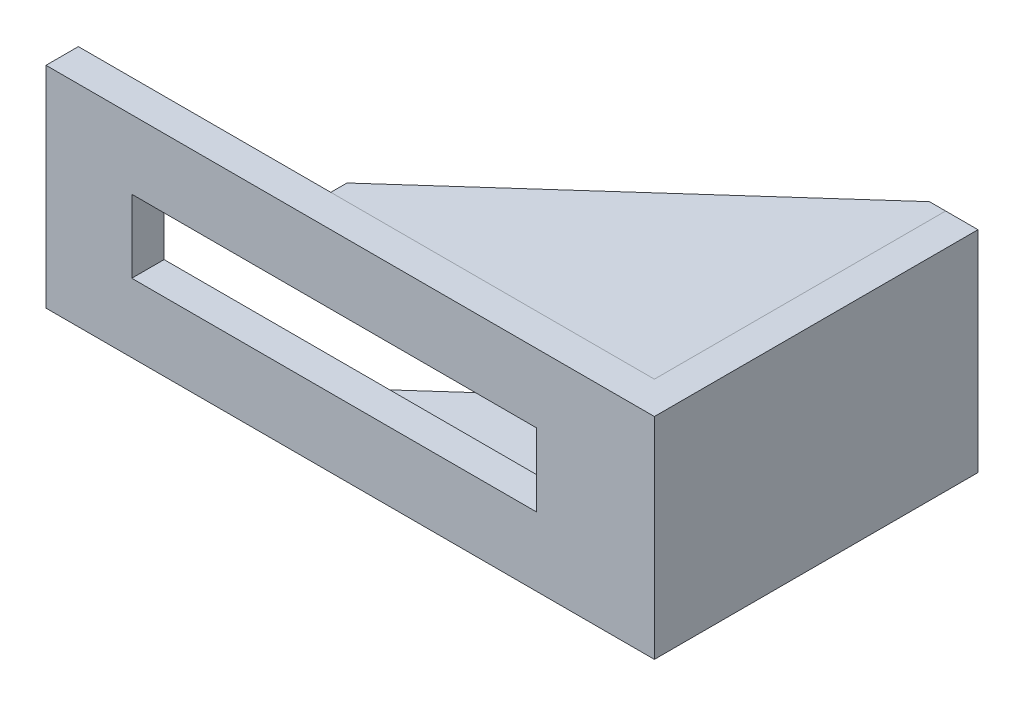
ISO-10303-21;
HEADER;
FILE_DESCRIPTION(('STEP AP214'),'2;1');
FILE_NAME('part.step','',(''),(''),'','','');
FILE_SCHEMA(('AUTOMOTIVE_DESIGN { 1 0 10303 214 1 1 1 1 }'));
ENDSEC;
DATA;
#1=APPLICATION_CONTEXT('core data for automotive mechanical design processes');
#2=APPLICATION_PROTOCOL_DEFINITION('international standard','automotive_design',2000,#1);
#3=PRODUCT_CONTEXT('',#1,'mechanical');
#4=PRODUCT('Part','Part','',(#3));
#5=PRODUCT_RELATED_PRODUCT_CATEGORY('part','',(#4));
#6=PRODUCT_DEFINITION_FORMATION('','',#4);
#7=PRODUCT_DEFINITION_CONTEXT('part definition',#1,'design');
#8=PRODUCT_DEFINITION('design','',#6,#7);
#9=PRODUCT_DEFINITION_SHAPE('','',#8);
#10=(LENGTH_UNIT() NAMED_UNIT(*) SI_UNIT(.MILLI.,.METRE.));
#11=(NAMED_UNIT(*) PLANE_ANGLE_UNIT() SI_UNIT($,.RADIAN.));
#12=(NAMED_UNIT(*) SI_UNIT($,.STERADIAN.) SOLID_ANGLE_UNIT());
#13=UNCERTAINTY_MEASURE_WITH_UNIT(LENGTH_MEASURE(1.E-05),#10,'distance_accuracy_value','');
#14=(GEOMETRIC_REPRESENTATION_CONTEXT(3) GLOBAL_UNCERTAINTY_ASSIGNED_CONTEXT((#13)) GLOBAL_UNIT_ASSIGNED_CONTEXT((#10,
#11,#12)) REPRESENTATION_CONTEXT('',''));
#15=CARTESIAN_POINT('',(0.,0.,0.));
#16=DIRECTION('',(0.,0.,1.));
#17=DIRECTION('',(1.,0.,0.));
#18=AXIS2_PLACEMENT_3D('',#15,#16,#17);
#19=CARTESIAN_POINT('',(178.,45.,0.));
#20=DIRECTION('',(1.,0.,0.));
#21=DIRECTION('',(0.,0.,-1.));
#22=AXIS2_PLACEMENT_3D('',#19,#20,#21);
#23=PLANE('',#22);
#24=DIRECTION('',(0.,0.,1.));
#25=VECTOR('',#24,1.);
#26=CARTESIAN_POINT('',(178.,65.,0.));
#27=LINE('',#26,#25);
#28=CARTESIAN_POINT('',(178.,65.,-180.));
#29=VERTEX_POINT('',#28);
#30=CARTESIAN_POINT('',(178.,65.,0.));
#31=VERTEX_POINT('',#30);
#32=EDGE_CURVE('E120',#29,#31,#27,.T.);
#33=ORIENTED_EDGE('',*,*,#32,.T.);
#34=DIRECTION('',(0.,1.,0.));
#35=VECTOR('',#34,1.);
#36=CARTESIAN_POINT('',(178.,45.,0.));
#37=LINE('',#36,#35);
#38=CARTESIAN_POINT('',(178.,45.,0.));
#39=VERTEX_POINT('',#38);
#40=EDGE_CURVE('E48',#39,#31,#37,.T.);
#41=ORIENTED_EDGE('',*,*,#40,.F.);
#42=DIRECTION('',(0.,0.,1.));
#43=VECTOR('',#42,1.);
#44=CARTESIAN_POINT('',(178.,45.,0.));
#45=LINE('',#44,#43);
#46=CARTESIAN_POINT('',(178.,45.,-180.));
#47=VERTEX_POINT('',#46);
#48=EDGE_CURVE('E127',#47,#39,#45,.T.);
#49=ORIENTED_EDGE('',*,*,#48,.F.);
#50=DIRECTION('',(0.,1.,0.));
#51=VECTOR('',#50,1.);
#52=CARTESIAN_POINT('',(178.,45.,-180.));
#53=LINE('',#52,#51);
#54=EDGE_CURVE('E12',#47,#29,#53,.T.);
#55=ORIENTED_EDGE('',*,*,#54,.T.);
#56=EDGE_LOOP('',(#33,#41,#49,#55));
#57=FACE_BOUND('',#56,.T.);
#58=ADVANCED_FACE('F45',(#57),#23,.T.);
#59=CARTESIAN_POINT('',(178.,45.,-180.));
#60=DIRECTION('',(0.,0.,-1.));
#61=DIRECTION('',(-1.,0.,0.));
#62=AXIS2_PLACEMENT_3D('',#59,#60,#61);
#63=PLANE('',#62);
#64=DIRECTION('',(1.,0.,0.));
#65=VECTOR('',#64,1.);
#66=CARTESIAN_POINT('',(178.,65.,-180.));
#67=LINE('',#66,#65);
#68=CARTESIAN_POINT('',(168.,65.,-180.));
#69=VERTEX_POINT('',#68);
#70=EDGE_CURVE('E89',#69,#29,#67,.T.);
#71=ORIENTED_EDGE('',*,*,#70,.T.);
#72=ORIENTED_EDGE('',*,*,#54,.F.);
#73=DIRECTION('',(1.,0.,0.));
#74=VECTOR('',#73,1.);
#75=CARTESIAN_POINT('',(178.,45.,-180.));
#76=LINE('',#75,#74);
#77=CARTESIAN_POINT('',(168.,45.,-180.));
#78=VERTEX_POINT('',#77);
#79=EDGE_CURVE('E63',#78,#47,#76,.T.);
#80=ORIENTED_EDGE('',*,*,#79,.F.);
#81=DIRECTION('',(0.,1.,0.));
#82=VECTOR('',#81,1.);
#83=CARTESIAN_POINT('',(168.,45.,-180.));
#84=LINE('',#83,#82);
#85=EDGE_CURVE('E54',#78,#69,#84,.T.);
#86=ORIENTED_EDGE('',*,*,#85,.T.);
#87=EDGE_LOOP('',(#71,#72,#80,#86));
#88=FACE_BOUND('',#87,.T.);
#89=ADVANCED_FACE('F144',(#88),#63,.T.);
#90=CARTESIAN_POINT('',(168.,45.,-180.));
#91=DIRECTION('',(-0.666794859469826,0.,-0.745241313525099));
#92=DIRECTION('',(-0.745241313525099,0.,0.666794859469826));
#93=AXIS2_PLACEMENT_3D('',#90,#91,#92);
#94=PLANE('',#93);
#95=DIRECTION('',(0.745241313525099,0.,-0.666794859469826));
#96=VECTOR('',#95,1.);
#97=CARTESIAN_POINT('',(168.,65.,-180.));
#98=LINE('',#97,#96);
#99=CARTESIAN_POINT('',(-22.,65.,-10.));
#100=VERTEX_POINT('',#99);
#101=EDGE_CURVE('E83',#100,#69,#98,.T.);
#102=ORIENTED_EDGE('',*,*,#101,.T.);
#103=ORIENTED_EDGE('',*,*,#85,.F.);
#104=DIRECTION('',(0.745241313525099,0.,-0.666794859469826));
#105=VECTOR('',#104,1.);
#106=CARTESIAN_POINT('',(168.,45.,-180.));
#107=LINE('',#106,#105);
#108=CARTESIAN_POINT('',(-22.,45.,-10.));
#109=VERTEX_POINT('',#108);
#110=EDGE_CURVE('E105',#109,#78,#107,.T.);
#111=ORIENTED_EDGE('',*,*,#110,.F.);
#112=DIRECTION('',(0.,1.,0.));
#113=VECTOR('',#112,1.);
#114=CARTESIAN_POINT('',(-22.,45.,-10.));
#115=LINE('',#114,#113);
#116=EDGE_CURVE('E109',#109,#100,#115,.T.);
#117=ORIENTED_EDGE('',*,*,#116,.T.);
#118=EDGE_LOOP('',(#102,#103,#111,#117));
#119=FACE_BOUND('',#118,.T.);
#120=ADVANCED_FACE('F115',(#119),#94,.T.);
#121=CARTESIAN_POINT('',(-22.,45.,-10.));
#122=DIRECTION('',(-1.,0.,0.));
#123=DIRECTION('',(0.,0.,1.));
#124=AXIS2_PLACEMENT_3D('',#121,#122,#123);
#125=PLANE('',#124);
#126=DIRECTION('',(0.,0.,-1.));
#127=VECTOR('',#126,1.);
#128=CARTESIAN_POINT('',(-22.,65.,-10.));
#129=LINE('',#128,#127);
#130=CARTESIAN_POINT('',(-22.,65.,0.));
#131=VERTEX_POINT('',#130);
#132=EDGE_CURVE('E112',#131,#100,#129,.T.);
#133=ORIENTED_EDGE('',*,*,#132,.T.);
#134=ORIENTED_EDGE('',*,*,#116,.F.);
#135=DIRECTION('',(0.,0.,-1.));
#136=VECTOR('',#135,1.);
#137=CARTESIAN_POINT('',(-22.,45.,-10.));
#138=LINE('',#137,#136);
#139=CARTESIAN_POINT('',(-22.,45.,0.));
#140=VERTEX_POINT('',#139);
#141=EDGE_CURVE('E101',#140,#109,#138,.T.);
#142=ORIENTED_EDGE('',*,*,#141,.F.);
#143=DIRECTION('',(0.,1.,0.));
#144=VECTOR('',#143,1.);
#145=CARTESIAN_POINT('',(-22.,45.,0.));
#146=LINE('',#145,#144);
#147=EDGE_CURVE('E113',#140,#131,#146,.T.);
#148=ORIENTED_EDGE('',*,*,#147,.T.);
#149=EDGE_LOOP('',(#133,#134,#142,#148));
#150=FACE_BOUND('',#149,.T.);
#151=ADVANCED_FACE('F110',(#150),#125,.T.);
#152=CARTESIAN_POINT('',(-22.,45.,0.));
#153=DIRECTION('',(0.,0.,1.));
#154=DIRECTION('',(1.,0.,0.));
#155=AXIS2_PLACEMENT_3D('',#152,#153,#154);
#156=PLANE('',#155);
#157=DIRECTION('',(-1.,0.,0.));
#158=VECTOR('',#157,1.);
#159=CARTESIAN_POINT('',(-22.,65.,0.));
#160=LINE('',#159,#158);
#161=EDGE_CURVE('E123',#31,#131,#160,.T.);
#162=ORIENTED_EDGE('',*,*,#161,.T.);
#163=ORIENTED_EDGE('',*,*,#147,.F.);
#164=DIRECTION('',(-1.,0.,0.));
#165=VECTOR('',#164,1.);
#166=CARTESIAN_POINT('',(-22.,45.,0.));
#167=LINE('',#166,#165);
#168=EDGE_CURVE('E97',#39,#140,#167,.T.);
#169=ORIENTED_EDGE('',*,*,#168,.F.);
#170=ORIENTED_EDGE('',*,*,#40,.T.);
#171=EDGE_LOOP('',(#162,#163,#169,#170));
#172=FACE_BOUND('',#171,.T.);
#173=ADVANCED_FACE('F130',(#172),#156,.T.);
#174=CARTESIAN_POINT('',(0.,45.,0.));
#175=DIRECTION('',(0.,-1.,0.));
#176=DIRECTION('',(0.,0.,1.));
#177=AXIS2_PLACEMENT_3D('',#174,#175,#176);
#178=PLANE('',#177);
#179=ORIENTED_EDGE('',*,*,#48,.T.);
#180=ORIENTED_EDGE('',*,*,#168,.T.);
#181=ORIENTED_EDGE('',*,*,#141,.T.);
#182=ORIENTED_EDGE('',*,*,#110,.T.);
#183=ORIENTED_EDGE('',*,*,#79,.T.);
#184=EDGE_LOOP('',(#179,#180,#181,#182,#183));
#185=FACE_BOUND('',#184,.T.);
#186=ADVANCED_FACE('F103',(#185),#178,.T.);
#187=CARTESIAN_POINT('',(0.,65.,0.));
#188=DIRECTION('',(0.,-1.,0.));
#189=DIRECTION('',(0.,0.,1.));
#190=AXIS2_PLACEMENT_3D('',#187,#188,#189);
#191=PLANE('',#190);
#192=ORIENTED_EDGE('',*,*,#32,.F.);
#193=ORIENTED_EDGE('',*,*,#70,.F.);
#194=ORIENTED_EDGE('',*,*,#101,.F.);
#195=ORIENTED_EDGE('',*,*,#132,.F.);
#196=ORIENTED_EDGE('',*,*,#161,.F.);
#197=EDGE_LOOP('',(#192,#193,#194,#195,#196));
#198=FACE_BOUND('',#197,.T.);
#199=ADVANCED_FACE('F135',(#198),#191,.F.);
#200=CLOSED_SHELL('',(#58,#89,#120,#151,#173,#186,#199));
#201=MANIFOLD_SOLID_BREP('B2',#200);
#202=CARTESIAN_POINT('',(178.,-45.,0.));
#203=DIRECTION('',(1.,0.,0.));
#204=DIRECTION('',(0.,0.,-1.));
#205=AXIS2_PLACEMENT_3D('',#202,#203,#204);
#206=PLANE('',#205);
#207=DIRECTION('',(0.,0.,1.));
#208=VECTOR('',#207,1.);
#209=CARTESIAN_POINT('',(178.,-65.,0.));
#210=LINE('',#209,#208);
#211=CARTESIAN_POINT('',(178.,-65.,-180.));
#212=VERTEX_POINT('',#211);
#213=CARTESIAN_POINT('',(178.,-65.,0.));
#214=VERTEX_POINT('',#213);
#215=EDGE_CURVE('E280',#212,#214,#210,.T.);
#216=ORIENTED_EDGE('',*,*,#215,.F.);
#217=DIRECTION('',(0.,-1.,0.));
#218=VECTOR('',#217,1.);
#219=CARTESIAN_POINT('',(178.,-45.,-180.));
#220=LINE('',#219,#218);
#221=CARTESIAN_POINT('',(178.,-45.,-180.));
#222=VERTEX_POINT('',#221);
#223=EDGE_CURVE('E43',#222,#212,#220,.T.);
#224=ORIENTED_EDGE('',*,*,#223,.F.);
#225=DIRECTION('',(0.,0.,1.));
#226=VECTOR('',#225,1.);
#227=CARTESIAN_POINT('',(178.,-45.,0.));
#228=LINE('',#227,#226);
#229=CARTESIAN_POINT('',(178.,-45.,0.));
#230=VERTEX_POINT('',#229);
#231=EDGE_CURVE('E275',#222,#230,#228,.T.);
#232=ORIENTED_EDGE('',*,*,#231,.T.);
#233=DIRECTION('',(0.,-1.,0.));
#234=VECTOR('',#233,1.);
#235=CARTESIAN_POINT('',(178.,-45.,0.));
#236=LINE('',#235,#234);
#237=EDGE_CURVE('E206',#230,#214,#236,.T.);
#238=ORIENTED_EDGE('',*,*,#237,.T.);
#239=EDGE_LOOP('',(#216,#224,#232,#238));
#240=FACE_BOUND('',#239,.T.);
#241=ADVANCED_FACE('F203',(#240),#206,.T.);
#242=CARTESIAN_POINT('',(178.,-45.,-180.));
#243=DIRECTION('',(0.,0.,-1.));
#244=DIRECTION('',(-1.,0.,0.));
#245=AXIS2_PLACEMENT_3D('',#242,#243,#244);
#246=PLANE('',#245);
#247=DIRECTION('',(1.,0.,0.));
#248=VECTOR('',#247,1.);
#249=CARTESIAN_POINT('',(178.,-65.,-180.));
#250=LINE('',#249,#248);
#251=CARTESIAN_POINT('',(168.,-65.,-180.));
#252=VERTEX_POINT('',#251);
#253=EDGE_CURVE('E289',#252,#212,#250,.T.);
#254=ORIENTED_EDGE('',*,*,#253,.F.);
#255=DIRECTION('',(0.,-1.,0.));
#256=VECTOR('',#255,1.);
#257=CARTESIAN_POINT('',(168.,-45.,-180.));
#258=LINE('',#257,#256);
#259=CARTESIAN_POINT('',(168.,-45.,-180.));
#260=VERTEX_POINT('',#259);
#261=EDGE_CURVE('E212',#260,#252,#258,.T.);
#262=ORIENTED_EDGE('',*,*,#261,.F.);
#263=DIRECTION('',(1.,0.,0.));
#264=VECTOR('',#263,1.);
#265=CARTESIAN_POINT('',(178.,-45.,-180.));
#266=LINE('',#265,#264);
#267=EDGE_CURVE('E270',#260,#222,#266,.T.);
#268=ORIENTED_EDGE('',*,*,#267,.T.);
#269=ORIENTED_EDGE('',*,*,#223,.T.);
#270=EDGE_LOOP('',(#254,#262,#268,#269));
#271=FACE_BOUND('',#270,.T.);
#272=ADVANCED_FACE('F295',(#271),#246,.T.);
#273=CARTESIAN_POINT('',(168.,-45.,-180.));
#274=DIRECTION('',(-0.666794859469826,0.,-0.745241313525099));
#275=DIRECTION('',(-0.745241313525099,0.,0.666794859469826));
#276=AXIS2_PLACEMENT_3D('',#273,#274,#275);
#277=PLANE('',#276);
#278=DIRECTION('',(0.745241313525099,0.,-0.666794859469826));
#279=VECTOR('',#278,1.);
#280=CARTESIAN_POINT('',(168.,-65.,-180.));
#281=LINE('',#280,#279);
#282=CARTESIAN_POINT('',(-22.,-65.,-10.));
#283=VERTEX_POINT('',#282);
#284=EDGE_CURVE('E259',#283,#252,#281,.T.);
#285=ORIENTED_EDGE('',*,*,#284,.F.);
#286=DIRECTION('',(0.,-1.,0.));
#287=VECTOR('',#286,1.);
#288=CARTESIAN_POINT('',(-22.,-45.,-10.));
#289=LINE('',#288,#287);
#290=CARTESIAN_POINT('',(-22.,-45.,-10.));
#291=VERTEX_POINT('',#290);
#292=EDGE_CURVE('E254',#291,#283,#289,.T.);
#293=ORIENTED_EDGE('',*,*,#292,.F.);
#294=DIRECTION('',(0.745241313525099,0.,-0.666794859469826));
#295=VECTOR('',#294,1.);
#296=CARTESIAN_POINT('',(168.,-45.,-180.));
#297=LINE('',#296,#295);
#298=EDGE_CURVE('E257',#291,#260,#297,.T.);
#299=ORIENTED_EDGE('',*,*,#298,.T.);
#300=ORIENTED_EDGE('',*,*,#261,.T.);
#301=EDGE_LOOP('',(#285,#293,#299,#300));
#302=FACE_BOUND('',#301,.T.);
#303=ADVANCED_FACE('F256',(#302),#277,.T.);
#304=CARTESIAN_POINT('',(-22.,-45.,-10.));
#305=DIRECTION('',(-1.,0.,0.));
#306=DIRECTION('',(0.,0.,1.));
#307=AXIS2_PLACEMENT_3D('',#304,#305,#306);
#308=PLANE('',#307);
#309=DIRECTION('',(0.,0.,-1.));
#310=VECTOR('',#309,1.);
#311=CARTESIAN_POINT('',(-22.,-65.,-10.));
#312=LINE('',#311,#310);
#313=CARTESIAN_POINT('',(-22.,-65.,0.));
#314=VERTEX_POINT('',#313);
#315=EDGE_CURVE('E286',#314,#283,#312,.T.);
#316=ORIENTED_EDGE('',*,*,#315,.F.);
#317=DIRECTION('',(0.,-1.,0.));
#318=VECTOR('',#317,1.);
#319=CARTESIAN_POINT('',(-22.,-45.,0.));
#320=LINE('',#319,#318);
#321=CARTESIAN_POINT('',(-22.,-45.,0.));
#322=VERTEX_POINT('',#321);
#323=EDGE_CURVE('E264',#322,#314,#320,.T.);
#324=ORIENTED_EDGE('',*,*,#323,.F.);
#325=DIRECTION('',(0.,0.,-1.));
#326=VECTOR('',#325,1.);
#327=CARTESIAN_POINT('',(-22.,-45.,-10.));
#328=LINE('',#327,#326);
#329=EDGE_CURVE('E269',#322,#291,#328,.T.);
#330=ORIENTED_EDGE('',*,*,#329,.T.);
#331=ORIENTED_EDGE('',*,*,#292,.T.);
#332=EDGE_LOOP('',(#316,#324,#330,#331));
#333=FACE_BOUND('',#332,.T.);
#334=ADVANCED_FACE('F272',(#333),#308,.T.);
#335=CARTESIAN_POINT('',(-22.,-45.,0.));
#336=DIRECTION('',(0.,0.,1.));
#337=DIRECTION('',(1.,0.,0.));
#338=AXIS2_PLACEMENT_3D('',#335,#336,#337);
#339=PLANE('',#338);
#340=DIRECTION('',(-1.,0.,0.));
#341=VECTOR('',#340,1.);
#342=CARTESIAN_POINT('',(-22.,-65.,0.));
#343=LINE('',#342,#341);
#344=EDGE_CURVE('E283',#214,#314,#343,.T.);
#345=ORIENTED_EDGE('',*,*,#344,.F.);
#346=ORIENTED_EDGE('',*,*,#237,.F.);
#347=DIRECTION('',(-1.,0.,0.));
#348=VECTOR('',#347,1.);
#349=CARTESIAN_POINT('',(-22.,-45.,0.));
#350=LINE('',#349,#348);
#351=EDGE_CURVE('E273',#230,#322,#350,.T.);
#352=ORIENTED_EDGE('',*,*,#351,.T.);
#353=ORIENTED_EDGE('',*,*,#323,.T.);
#354=EDGE_LOOP('',(#345,#346,#352,#353));
#355=FACE_BOUND('',#354,.T.);
#356=ADVANCED_FACE('F292',(#355),#339,.T.);
#357=CARTESIAN_POINT('',(0.,-45.,0.));
#358=DIRECTION('',(0.,1.,0.));
#359=DIRECTION('',(0.,0.,1.));
#360=AXIS2_PLACEMENT_3D('',#357,#358,#359);
#361=PLANE('',#360);
#362=ORIENTED_EDGE('',*,*,#231,.F.);
#363=ORIENTED_EDGE('',*,*,#267,.F.);
#364=ORIENTED_EDGE('',*,*,#298,.F.);
#365=ORIENTED_EDGE('',*,*,#329,.F.);
#366=ORIENTED_EDGE('',*,*,#351,.F.);
#367=EDGE_LOOP('',(#362,#363,#364,#365,#366));
#368=FACE_BOUND('',#367,.T.);
#369=ADVANCED_FACE('F268',(#368),#361,.T.);
#370=CARTESIAN_POINT('',(0.,-65.,0.));
#371=DIRECTION('',(0.,1.,0.));
#372=DIRECTION('',(0.,0.,1.));
#373=AXIS2_PLACEMENT_3D('',#370,#371,#372);
#374=PLANE('',#373);
#375=ORIENTED_EDGE('',*,*,#215,.T.);
#376=ORIENTED_EDGE('',*,*,#344,.T.);
#377=ORIENTED_EDGE('',*,*,#315,.T.);
#378=ORIENTED_EDGE('',*,*,#284,.T.);
#379=ORIENTED_EDGE('',*,*,#253,.T.);
#380=EDGE_LOOP('',(#375,#376,#377,#378,#379));
#381=FACE_BOUND('',#380,.T.);
#382=ADVANCED_FACE('F294',(#381),#374,.F.);
#383=CLOSED_SHELL('',(#241,#272,#303,#334,#356,#369,#382));
#384=MANIFOLD_SOLID_BREP('B6',#383);
#385=CARTESIAN_POINT('',(-178.,65.,20.));
#386=DIRECTION('',(0.,-1.,0.));
#387=DIRECTION('',(0.,0.,-1.));
#388=AXIS2_PLACEMENT_3D('',#385,#386,#387);
#389=PLANE('',#388);
#390=DIRECTION('',(-1.,0.,0.));
#391=VECTOR('',#390,1.);
#392=CARTESIAN_POINT('',(-178.,65.,0.));
#393=LINE('',#392,#391);
#394=CARTESIAN_POINT('',(178.,65.,0.));
#395=VERTEX_POINT('',#394);
#396=CARTESIAN_POINT('',(-178.,65.,0.));
#397=VERTEX_POINT('',#396);
#398=EDGE_CURVE('E490',#395,#397,#393,.T.);
#399=ORIENTED_EDGE('',*,*,#398,.T.);
#400=DIRECTION('',(0.,0.,-1.));
#401=VECTOR('',#400,1.);
#402=CARTESIAN_POINT('',(-178.,65.,20.));
#403=LINE('',#402,#401);
#404=CARTESIAN_POINT('',(-178.,65.,20.));
#405=VERTEX_POINT('',#404);
#406=EDGE_CURVE('E497',#405,#397,#403,.T.);
#407=ORIENTED_EDGE('',*,*,#406,.F.);
#408=DIRECTION('',(-1.,0.,0.));
#409=VECTOR('',#408,1.);
#410=CARTESIAN_POINT('',(-178.,65.,20.));
#411=LINE('',#410,#409);
#412=CARTESIAN_POINT('',(198.,65.,20.));
#413=VERTEX_POINT('',#412);
#414=EDGE_CURVE('E480',#413,#405,#411,.T.);
#415=ORIENTED_EDGE('',*,*,#414,.F.);
#416=DIRECTION('',(0.,0.,1.));
#417=VECTOR('',#416,1.);
#418=CARTESIAN_POINT('',(198.,65.,20.));
#419=LINE('',#418,#417);
#420=CARTESIAN_POINT('',(198.,65.,-180.));
#421=VERTEX_POINT('',#420);
#422=EDGE_CURVE('E465',#421,#413,#419,.T.);
#423=ORIENTED_EDGE('',*,*,#422,.F.);
#424=DIRECTION('',(-1.,0.,0.));
#425=VECTOR('',#424,1.);
#426=CARTESIAN_POINT('',(198.,65.,-180.));
#427=LINE('',#426,#425);
#428=CARTESIAN_POINT('',(178.,65.,-180.));
#429=VERTEX_POINT('',#428);
#430=EDGE_CURVE('E468',#421,#429,#427,.T.);
#431=ORIENTED_EDGE('',*,*,#430,.T.);
#432=DIRECTION('',(0.,0.,1.));
#433=VECTOR('',#432,1.);
#434=CARTESIAN_POINT('',(178.,65.,20.));
#435=LINE('',#434,#433);
#436=EDGE_CURVE('E461',#429,#395,#435,.T.);
#437=ORIENTED_EDGE('',*,*,#436,.T.);
#438=EDGE_LOOP('',(#399,#407,#415,#423,#431,#437));
#439=FACE_BOUND('',#438,.T.);
#440=ADVANCED_FACE('F352',(#439),#389,.F.);
#441=CARTESIAN_POINT('',(-178.,65.,20.));
#442=DIRECTION('',(1.,0.,0.));
#443=DIRECTION('',(0.,0.,-1.));
#444=AXIS2_PLACEMENT_3D('',#441,#442,#443);
#445=PLANE('',#444);
#446=DIRECTION('',(0.,-1.,0.));
#447=VECTOR('',#446,1.);
#448=CARTESIAN_POINT('',(-178.,65.,0.));
#449=LINE('',#448,#447);
#450=CARTESIAN_POINT('',(-178.,-65.,0.));
#451=VERTEX_POINT('',#450);
#452=EDGE_CURVE('E492',#397,#451,#449,.T.);
#453=ORIENTED_EDGE('',*,*,#452,.T.);
#454=DIRECTION('',(0.,0.,-1.));
#455=VECTOR('',#454,1.);
#456=CARTESIAN_POINT('',(-178.,-65.,20.));
#457=LINE('',#456,#455);
#458=CARTESIAN_POINT('',(-178.,-65.,20.));
#459=VERTEX_POINT('',#458);
#460=EDGE_CURVE('E487',#459,#451,#457,.T.);
#461=ORIENTED_EDGE('',*,*,#460,.F.);
#462=DIRECTION('',(0.,-1.,0.));
#463=VECTOR('',#462,1.);
#464=CARTESIAN_POINT('',(-178.,65.,20.));
#465=LINE('',#464,#463);
#466=EDGE_CURVE('E482',#405,#459,#465,.T.);
#467=ORIENTED_EDGE('',*,*,#466,.F.);
#468=ORIENTED_EDGE('',*,*,#406,.T.);
#469=EDGE_LOOP('',(#453,#461,#467,#468));
#470=FACE_BOUND('',#469,.T.);
#471=ADVANCED_FACE('F524',(#470),#445,.F.);
#472=CARTESIAN_POINT('',(-178.,-65.,20.));
#473=DIRECTION('',(0.,1.,0.));
#474=DIRECTION('',(0.,0.,1.));
#475=AXIS2_PLACEMENT_3D('',#472,#473,#474);
#476=PLANE('',#475);
#477=DIRECTION('',(1.,0.,0.));
#478=VECTOR('',#477,1.);
#479=CARTESIAN_POINT('',(-178.,-65.,0.));
#480=LINE('',#479,#478);
#481=CARTESIAN_POINT('',(178.,-65.,0.));
#482=VERTEX_POINT('',#481);
#483=EDGE_CURVE('E483',#451,#482,#480,.T.);
#484=ORIENTED_EDGE('',*,*,#483,.T.);
#485=DIRECTION('',(0.,0.,-1.));
#486=VECTOR('',#485,1.);
#487=CARTESIAN_POINT('',(178.,-65.,20.));
#488=LINE('',#487,#486);
#489=CARTESIAN_POINT('',(178.,-65.,-180.));
#490=VERTEX_POINT('',#489);
#491=EDGE_CURVE('E454',#482,#490,#488,.T.);
#492=ORIENTED_EDGE('',*,*,#491,.T.);
#493=DIRECTION('',(-1.,0.,0.));
#494=VECTOR('',#493,1.);
#495=CARTESIAN_POINT('',(198.,-65.,-180.));
#496=LINE('',#495,#494);
#497=CARTESIAN_POINT('',(198.,-65.,-180.));
#498=VERTEX_POINT('',#497);
#499=EDGE_CURVE('E476',#498,#490,#496,.T.);
#500=ORIENTED_EDGE('',*,*,#499,.F.);
#501=DIRECTION('',(0.,0.,-1.));
#502=VECTOR('',#501,1.);
#503=CARTESIAN_POINT('',(198.,-65.,20.));
#504=LINE('',#503,#502);
#505=CARTESIAN_POINT('',(198.,-65.,20.));
#506=VERTEX_POINT('',#505);
#507=EDGE_CURVE('E460',#506,#498,#504,.T.);
#508=ORIENTED_EDGE('',*,*,#507,.F.);
#509=DIRECTION('',(1.,0.,0.));
#510=VECTOR('',#509,1.);
#511=CARTESIAN_POINT('',(-178.,-65.,20.));
#512=LINE('',#511,#510);
#513=EDGE_CURVE('E485',#459,#506,#512,.T.);
#514=ORIENTED_EDGE('',*,*,#513,.F.);
#515=ORIENTED_EDGE('',*,*,#460,.T.);
#516=EDGE_LOOP('',(#484,#492,#500,#508,#514,#515));
#517=FACE_BOUND('',#516,.T.);
#518=ADVANCED_FACE('F529',(#517),#476,.F.);
#519=CARTESIAN_POINT('',(0.,0.,20.));
#520=DIRECTION('',(0.,0.,1.));
#521=DIRECTION('',(1.,0.,0.));
#522=AXIS2_PLACEMENT_3D('',#519,#520,#521);
#523=PLANE('',#522);
#524=DIRECTION('',(0.,1.,0.));
#525=VECTOR('',#524,1.);
#526=CARTESIAN_POINT('',(125.,22.5,20.));
#527=LINE('',#526,#525);
#528=CARTESIAN_POINT('',(125.,-22.5,20.));
#529=VERTEX_POINT('',#528);
#530=CARTESIAN_POINT('',(125.,22.5,20.));
#531=VERTEX_POINT('',#530);
#532=EDGE_CURVE('E366',#529,#531,#527,.T.);
#533=ORIENTED_EDGE('',*,*,#532,.F.);
#534=DIRECTION('',(1.,0.,0.));
#535=VECTOR('',#534,1.);
#536=CARTESIAN_POINT('',(-125.,-22.5,20.));
#537=LINE('',#536,#535);
#538=CARTESIAN_POINT('',(-125.,-22.5,20.));
#539=VERTEX_POINT('',#538);
#540=EDGE_CURVE('E447',#539,#529,#537,.T.);
#541=ORIENTED_EDGE('',*,*,#540,.F.);
#542=DIRECTION('',(0.,-1.,0.));
#543=VECTOR('',#542,1.);
#544=CARTESIAN_POINT('',(-125.,22.5,20.));
#545=LINE('',#544,#543);
#546=CARTESIAN_POINT('',(-125.,22.5,20.));
#547=VERTEX_POINT('',#546);
#548=EDGE_CURVE('E431',#547,#539,#545,.T.);
#549=ORIENTED_EDGE('',*,*,#548,.F.);
#550=DIRECTION('',(-1.,0.,0.));
#551=VECTOR('',#550,1.);
#552=CARTESIAN_POINT('',(-125.,22.5,20.));
#553=LINE('',#552,#551);
#554=EDGE_CURVE('E440',#531,#547,#553,.T.);
#555=ORIENTED_EDGE('',*,*,#554,.F.);
#556=EDGE_LOOP('',(#533,#541,#549,#555));
#557=FACE_BOUND('',#556,.T.);
#558=ORIENTED_EDGE('',*,*,#513,.T.);
#559=DIRECTION('',(0.,-1.,0.));
#560=VECTOR('',#559,1.);
#561=CARTESIAN_POINT('',(198.,-65.,20.));
#562=LINE('',#561,#560);
#563=EDGE_CURVE('E457',#413,#506,#562,.T.);
#564=ORIENTED_EDGE('',*,*,#563,.F.);
#565=ORIENTED_EDGE('',*,*,#414,.T.);
#566=ORIENTED_EDGE('',*,*,#466,.T.);
#567=EDGE_LOOP('',(#558,#564,#565,#566));
#568=FACE_BOUND('',#567,.T.);
#569=ADVANCED_FACE('F444',(#557,#568),#523,.T.);
#570=CARTESIAN_POINT('',(0.,0.,0.));
#571=DIRECTION('',(0.,0.,1.));
#572=DIRECTION('',(1.,0.,0.));
#573=AXIS2_PLACEMENT_3D('',#570,#571,#572);
#574=PLANE('',#573);
#575=DIRECTION('',(1.,0.,0.));
#576=VECTOR('',#575,1.);
#577=CARTESIAN_POINT('',(0.,-22.5,0.));
#578=LINE('',#577,#576);
#579=CARTESIAN_POINT('',(-125.,-22.5,0.));
#580=VERTEX_POINT('',#579);
#581=CARTESIAN_POINT('',(125.,-22.5,0.));
#582=VERTEX_POINT('',#581);
#583=EDGE_CURVE('E359',#580,#582,#578,.T.);
#584=ORIENTED_EDGE('',*,*,#583,.T.);
#585=DIRECTION('',(0.,1.,0.));
#586=VECTOR('',#585,1.);
#587=CARTESIAN_POINT('',(125.,0.,0.));
#588=LINE('',#587,#586);
#589=CARTESIAN_POINT('',(125.,22.5,0.));
#590=VERTEX_POINT('',#589);
#591=EDGE_CURVE('E201',#582,#590,#588,.T.);
#592=ORIENTED_EDGE('',*,*,#591,.T.);
#593=DIRECTION('',(-1.,0.,0.));
#594=VECTOR('',#593,1.);
#595=CARTESIAN_POINT('',(0.,22.5,0.));
#596=LINE('',#595,#594);
#597=CARTESIAN_POINT('',(-125.,22.5,0.));
#598=VERTEX_POINT('',#597);
#599=EDGE_CURVE('E500',#590,#598,#596,.T.);
#600=ORIENTED_EDGE('',*,*,#599,.T.);
#601=DIRECTION('',(0.,-1.,0.));
#602=VECTOR('',#601,1.);
#603=CARTESIAN_POINT('',(-125.,0.,0.));
#604=LINE('',#603,#602);
#605=EDGE_CURVE('E434',#598,#580,#604,.T.);
#606=ORIENTED_EDGE('',*,*,#605,.T.);
#607=EDGE_LOOP('',(#584,#592,#600,#606));
#608=FACE_BOUND('',#607,.T.);
#609=DIRECTION('',(0.,1.,0.));
#610=VECTOR('',#609,1.);
#611=CARTESIAN_POINT('',(178.,65.,0.));
#612=LINE('',#611,#610);
#613=EDGE_CURVE('E479',#482,#395,#612,.T.);
#614=ORIENTED_EDGE('',*,*,#613,.F.);
#615=ORIENTED_EDGE('',*,*,#483,.F.);
#616=ORIENTED_EDGE('',*,*,#452,.F.);
#617=ORIENTED_EDGE('',*,*,#398,.F.);
#618=EDGE_LOOP('',(#614,#615,#616,#617));
#619=FACE_BOUND('',#618,.T.);
#620=ADVANCED_FACE('F504',(#608,#619),#574,.F.);
#621=CARTESIAN_POINT('',(198.,-65.,-180.));
#622=DIRECTION('',(0.,0.,1.));
#623=DIRECTION('',(1.,0.,0.));
#624=AXIS2_PLACEMENT_3D('',#621,#622,#623);
#625=PLANE('',#624);
#626=DIRECTION('',(0.,1.,0.));
#627=VECTOR('',#626,1.);
#628=CARTESIAN_POINT('',(178.,-65.,-180.));
#629=LINE('',#628,#627);
#630=EDGE_CURVE('E470',#490,#429,#629,.T.);
#631=ORIENTED_EDGE('',*,*,#630,.T.);
#632=ORIENTED_EDGE('',*,*,#430,.F.);
#633=DIRECTION('',(0.,1.,0.));
#634=VECTOR('',#633,1.);
#635=CARTESIAN_POINT('',(198.,-65.,-180.));
#636=LINE('',#635,#634);
#637=EDGE_CURVE('E463',#498,#421,#636,.T.);
#638=ORIENTED_EDGE('',*,*,#637,.F.);
#639=ORIENTED_EDGE('',*,*,#499,.T.);
#640=EDGE_LOOP('',(#631,#632,#638,#639));
#641=FACE_BOUND('',#640,.T.);
#642=ADVANCED_FACE('F549',(#641),#625,.F.);
#643=CARTESIAN_POINT('',(198.,0.,0.));
#644=DIRECTION('',(-1.,0.,0.));
#645=DIRECTION('',(0.,0.,1.));
#646=AXIS2_PLACEMENT_3D('',#643,#644,#645);
#647=PLANE('',#646);
#648=ORIENTED_EDGE('',*,*,#563,.T.);
#649=ORIENTED_EDGE('',*,*,#507,.T.);
#650=ORIENTED_EDGE('',*,*,#637,.T.);
#651=ORIENTED_EDGE('',*,*,#422,.T.);
#652=EDGE_LOOP('',(#648,#649,#650,#651));
#653=FACE_BOUND('',#652,.T.);
#654=ADVANCED_FACE('F518',(#653),#647,.F.);
#655=CARTESIAN_POINT('',(178.,0.,0.));
#656=DIRECTION('',(-1.,0.,0.));
#657=DIRECTION('',(0.,0.,1.));
#658=AXIS2_PLACEMENT_3D('',#655,#656,#657);
#659=PLANE('',#658);
#660=ORIENTED_EDGE('',*,*,#491,.F.);
#661=ORIENTED_EDGE('',*,*,#613,.T.);
#662=ORIENTED_EDGE('',*,*,#436,.F.);
#663=ORIENTED_EDGE('',*,*,#630,.F.);
#664=EDGE_LOOP('',(#660,#661,#662,#663));
#665=FACE_BOUND('',#664,.T.);
#666=ADVANCED_FACE('F511',(#665),#659,.T.);
#667=CARTESIAN_POINT('',(125.,22.5,-180.));
#668=DIRECTION('',(1.,0.,0.));
#669=DIRECTION('',(0.,0.,-1.));
#670=AXIS2_PLACEMENT_3D('',#667,#668,#669);
#671=PLANE('',#670);
#672=DIRECTION('',(0.,0.,1.));
#673=VECTOR('',#672,1.);
#674=CARTESIAN_POINT('',(125.,-22.5,-180.));
#675=LINE('',#674,#673);
#676=EDGE_CURVE('E452',#582,#529,#675,.T.);
#677=ORIENTED_EDGE('',*,*,#676,.T.);
#678=ORIENTED_EDGE('',*,*,#532,.T.);
#679=DIRECTION('',(0.,0.,1.));
#680=VECTOR('',#679,1.);
#681=CARTESIAN_POINT('',(125.,22.5,-180.));
#682=LINE('',#681,#680);
#683=EDGE_CURVE('E437',#590,#531,#682,.T.);
#684=ORIENTED_EDGE('',*,*,#683,.F.);
#685=ORIENTED_EDGE('',*,*,#591,.F.);
#686=EDGE_LOOP('',(#677,#678,#684,#685));
#687=FACE_BOUND('',#686,.T.);
#688=ADVANCED_FACE('F509',(#687),#671,.F.);
#689=CARTESIAN_POINT('',(-125.,-22.5,-180.));
#690=DIRECTION('',(0.,-1.,0.));
#691=DIRECTION('',(0.,0.,-1.));
#692=AXIS2_PLACEMENT_3D('',#689,#690,#691);
#693=PLANE('',#692);
#694=DIRECTION('',(0.,0.,1.));
#695=VECTOR('',#694,1.);
#696=CARTESIAN_POINT('',(-125.,-22.5,-180.));
#697=LINE('',#696,#695);
#698=EDGE_CURVE('E436',#580,#539,#697,.T.);
#699=ORIENTED_EDGE('',*,*,#698,.T.);
#700=ORIENTED_EDGE('',*,*,#540,.T.);
#701=ORIENTED_EDGE('',*,*,#676,.F.);
#702=ORIENTED_EDGE('',*,*,#583,.F.);
#703=EDGE_LOOP('',(#699,#700,#701,#702));
#704=FACE_BOUND('',#703,.T.);
#705=ADVANCED_FACE('F508',(#704),#693,.F.);
#706=CARTESIAN_POINT('',(-125.,22.5,-180.));
#707=DIRECTION('',(-1.,0.,0.));
#708=DIRECTION('',(0.,0.,1.));
#709=AXIS2_PLACEMENT_3D('',#706,#707,#708);
#710=PLANE('',#709);
#711=DIRECTION('',(0.,0.,1.));
#712=VECTOR('',#711,1.);
#713=CARTESIAN_POINT('',(-125.,22.5,-180.));
#714=LINE('',#713,#712);
#715=EDGE_CURVE('E374',#598,#547,#714,.T.);
#716=ORIENTED_EDGE('',*,*,#715,.T.);
#717=ORIENTED_EDGE('',*,*,#548,.T.);
#718=ORIENTED_EDGE('',*,*,#698,.F.);
#719=ORIENTED_EDGE('',*,*,#605,.F.);
#720=EDGE_LOOP('',(#716,#717,#718,#719));
#721=FACE_BOUND('',#720,.T.);
#722=ADVANCED_FACE('F428',(#721),#710,.F.);
#723=CARTESIAN_POINT('',(-125.,22.5,-180.));
#724=DIRECTION('',(0.,1.,0.));
#725=DIRECTION('',(0.,0.,1.));
#726=AXIS2_PLACEMENT_3D('',#723,#724,#725);
#727=PLANE('',#726);
#728=ORIENTED_EDGE('',*,*,#683,.T.);
#729=ORIENTED_EDGE('',*,*,#554,.T.);
#730=ORIENTED_EDGE('',*,*,#715,.F.);
#731=ORIENTED_EDGE('',*,*,#599,.F.);
#732=EDGE_LOOP('',(#728,#729,#730,#731));
#733=FACE_BOUND('',#732,.T.);
#734=ADVANCED_FACE('F441',(#733),#727,.F.);
#735=CLOSED_SHELL('',(#440,#471,#518,#569,#620,#642,#654,#666,#688,#705,#722,#734));
#736=MANIFOLD_SOLID_BREP('B37',#735);
#737=ADVANCED_BREP_SHAPE_REPRESENTATION('',(#18,#201,#384,#736),#14);
#738=SHAPE_DEFINITION_REPRESENTATION(#9,#737);
ENDSEC;
END-ISO-10303-21;
